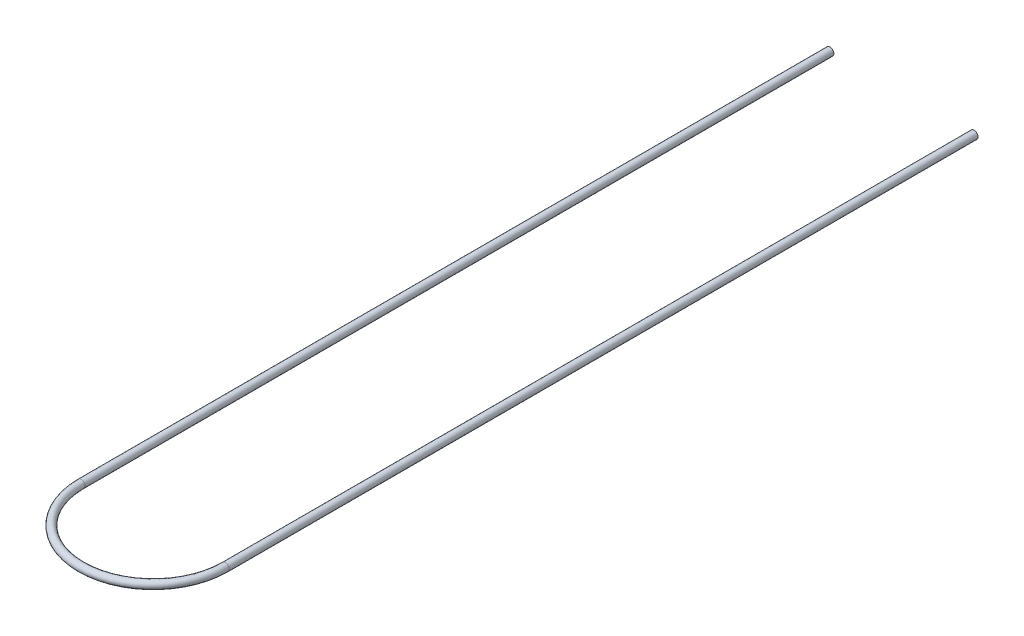
ISO-10303-21;
HEADER;
FILE_DESCRIPTION(('STEP AP214'),'2;1');
FILE_NAME('part.step','',(''),(''),'','','');
FILE_SCHEMA(('AUTOMOTIVE_DESIGN { 1 0 10303 214 1 1 1 1 }'));
ENDSEC;
DATA;
#1=APPLICATION_CONTEXT('core data for automotive mechanical design processes');
#2=APPLICATION_PROTOCOL_DEFINITION('international standard','automotive_design',2000,#1);
#3=PRODUCT_CONTEXT('',#1,'mechanical');
#4=PRODUCT('Part','Part','',(#3));
#5=PRODUCT_RELATED_PRODUCT_CATEGORY('part','',(#4));
#6=PRODUCT_DEFINITION_FORMATION('','',#4);
#7=PRODUCT_DEFINITION_CONTEXT('part definition',#1,'design');
#8=PRODUCT_DEFINITION('design','',#6,#7);
#9=PRODUCT_DEFINITION_SHAPE('','',#8);
#10=(LENGTH_UNIT() NAMED_UNIT(*) SI_UNIT(.MILLI.,.METRE.));
#11=(NAMED_UNIT(*) PLANE_ANGLE_UNIT() SI_UNIT($,.RADIAN.));
#12=(NAMED_UNIT(*) SI_UNIT($,.STERADIAN.) SOLID_ANGLE_UNIT());
#13=UNCERTAINTY_MEASURE_WITH_UNIT(LENGTH_MEASURE(1.E-05),#10,'distance_accuracy_value','');
#14=(GEOMETRIC_REPRESENTATION_CONTEXT(3) GLOBAL_UNCERTAINTY_ASSIGNED_CONTEXT((#13)) GLOBAL_UNIT_ASSIGNED_CONTEXT((#10,
#11,#12)) REPRESENTATION_CONTEXT('',''));
#15=CARTESIAN_POINT('',(0.,0.,0.));
#16=DIRECTION('',(0.,0.,1.));
#17=DIRECTION('',(1.,0.,0.));
#18=AXIS2_PLACEMENT_3D('',#15,#16,#17);
#19=CARTESIAN_POINT('',(-40.,0.,299.999999999999));
#20=DIRECTION('',(0.,0.,1.));
#21=DIRECTION('',(1.,0.,0.));
#22=AXIS2_PLACEMENT_3D('',#19,#20,#21);
#23=CYLINDRICAL_SURFACE('',#22,11.1);
#24=CARTESIAN_POINT('',(-39.9999999999997,0.,2440.));
#25=DIRECTION('',(0.,0.,1.));
#26=DIRECTION('',(1.,0.,0.));
#27=AXIS2_PLACEMENT_3D('',#24,#25,#26);
#28=CIRCLE('',#27,11.1);
#29=CARTESIAN_POINT('',(-51.0999999999997,0.,2440.));
#30=VERTEX_POINT('',#29);
#31=EDGE_CURVE('E54',#30,#30,#28,.T.);
#32=ORIENTED_EDGE('',*,*,#31,.F.);
#33=EDGE_LOOP('',(#32));
#34=FACE_BOUND('',#33,.T.);
#35=CARTESIAN_POINT('',(-40.,0.,299.999999999999));
#36=DIRECTION('',(0.,0.,1.));
#37=DIRECTION('',(1.,0.,0.));
#38=AXIS2_PLACEMENT_3D('',#35,#36,#37);
#39=CIRCLE('',#38,11.1);
#40=CARTESIAN_POINT('',(-28.9,0.,299.999999999999));
#41=VERTEX_POINT('',#40);
#42=EDGE_CURVE('E52',#41,#41,#39,.T.);
#43=ORIENTED_EDGE('',*,*,#42,.T.);
#44=EDGE_LOOP('',(#43));
#45=FACE_BOUND('',#44,.T.);
#46=ADVANCED_FACE('F31',(#34,#45),#23,.T.);
#47=CARTESIAN_POINT('',(166.,0.,2440.));
#48=DIRECTION('',(0.,1.,0.));
#49=DIRECTION('',(0.,0.,1.));
#50=AXIS2_PLACEMENT_3D('',#47,#48,#49);
#51=TOROIDAL_SURFACE('',#50,206.,11.1);
#52=CARTESIAN_POINT('',(372.,0.,2440.));
#53=DIRECTION('',(0.,0.,-1.));
#54=DIRECTION('',(-1.,0.,0.));
#55=AXIS2_PLACEMENT_3D('',#52,#53,#54);
#56=CIRCLE('',#55,11.1);
#57=CARTESIAN_POINT('',(383.1,0.,2440.));
#58=VERTEX_POINT('',#57);
#59=EDGE_CURVE('E35',#58,#58,#56,.T.);
#60=CARTESIAN_POINT('',(166.,0.,2440.));
#61=DIRECTION('',(0.,1.,0.));
#62=DIRECTION('',(0.,0.,1.));
#63=AXIS2_PLACEMENT_3D('',#60,#61,#62);
#64=CIRCLE('',#63,217.1);
#65=EDGE_CURVE('',#30,#58,#64,.T.);
#66=ORIENTED_EDGE('',*,*,#31,.T.);
#67=ORIENTED_EDGE('',*,*,#59,.F.);
#68=ORIENTED_EDGE('',*,*,#65,.T.);
#69=ORIENTED_EDGE('',*,*,#65,.F.);
#70=EDGE_LOOP('',(#66,#68,#67,#69));
#71=FACE_BOUND('',#70,.T.);
#72=ADVANCED_FACE('F62',(#71),#51,.T.);
#73=CARTESIAN_POINT('',(372.,0.,2440.));
#74=DIRECTION('',(0.,0.,-1.));
#75=DIRECTION('',(-1.,0.,0.));
#76=AXIS2_PLACEMENT_3D('',#73,#74,#75);
#77=CYLINDRICAL_SURFACE('',#76,11.1);
#78=CARTESIAN_POINT('',(372.,0.,299.999999999999));
#79=DIRECTION('',(0.,0.,-1.));
#80=DIRECTION('',(-1.,0.,0.));
#81=AXIS2_PLACEMENT_3D('',#78,#79,#80);
#82=CIRCLE('',#81,11.1);
#83=CARTESIAN_POINT('',(360.9,0.,299.999999999999));
#84=VERTEX_POINT('',#83);
#85=EDGE_CURVE('E48',#84,#84,#82,.T.);
#86=ORIENTED_EDGE('',*,*,#85,.F.);
#87=EDGE_LOOP('',(#86));
#88=FACE_BOUND('',#87,.T.);
#89=ORIENTED_EDGE('',*,*,#59,.T.);
#90=EDGE_LOOP('',(#89));
#91=FACE_BOUND('',#90,.T.);
#92=ADVANCED_FACE('F33',(#88,#91),#77,.T.);
#93=CARTESIAN_POINT('',(-40.,0.,299.999999999999));
#94=DIRECTION('',(0.,0.,1.));
#95=DIRECTION('',(1.,0.,0.));
#96=AXIS2_PLACEMENT_3D('',#93,#94,#95);
#97=PLANE('',#96);
#98=CARTESIAN_POINT('',(-40.,0.,299.999999999999));
#99=DIRECTION('',(0.,0.,1.));
#100=DIRECTION('',(1.,0.,0.));
#101=AXIS2_PLACEMENT_3D('',#98,#99,#100);
#102=CIRCLE('',#101,9.95000000000001);
#103=CARTESIAN_POINT('',(-30.05,0.,299.999999999999));
#104=VERTEX_POINT('',#103);
#105=EDGE_CURVE('E51',#104,#104,#102,.F.);
#106=ORIENTED_EDGE('',*,*,#105,.F.);
#107=EDGE_LOOP('',(#106));
#108=FACE_BOUND('',#107,.T.);
#109=ORIENTED_EDGE('',*,*,#42,.F.);
#110=EDGE_LOOP('',(#109));
#111=FACE_BOUND('',#110,.T.);
#112=ADVANCED_FACE('F68',(#108,#111),#97,.F.);
#113=CARTESIAN_POINT('',(372.,0.,299.999999999999));
#114=DIRECTION('',(0.,0.,-1.));
#115=DIRECTION('',(-1.,0.,0.));
#116=AXIS2_PLACEMENT_3D('',#113,#114,#115);
#117=PLANE('',#116);
#118=CARTESIAN_POINT('',(372.,0.,299.999999999999));
#119=DIRECTION('',(0.,0.,-1.));
#120=DIRECTION('',(-1.,0.,0.));
#121=AXIS2_PLACEMENT_3D('',#118,#119,#120);
#122=CIRCLE('',#121,9.95000000000001);
#123=CARTESIAN_POINT('',(362.05,0.,299.999999999999));
#124=VERTEX_POINT('',#123);
#125=EDGE_CURVE('E10',#124,#124,#122,.F.);
#126=ORIENTED_EDGE('',*,*,#125,.T.);
#127=EDGE_LOOP('',(#126));
#128=FACE_BOUND('',#127,.T.);
#129=ORIENTED_EDGE('',*,*,#85,.T.);
#130=EDGE_LOOP('',(#129));
#131=FACE_BOUND('',#130,.T.);
#132=ADVANCED_FACE('F86',(#128,#131),#117,.T.);
#133=CARTESIAN_POINT('',(-40.,0.,299.999999999999));
#134=DIRECTION('',(0.,0.,1.));
#135=DIRECTION('',(1.,0.,0.));
#136=AXIS2_PLACEMENT_3D('',#133,#134,#135);
#137=CYLINDRICAL_SURFACE('',#136,9.95000000000001);
#138=CARTESIAN_POINT('',(-39.9999999999997,0.,2440.));
#139=DIRECTION('',(0.,0.,1.));
#140=DIRECTION('',(1.,0.,0.));
#141=AXIS2_PLACEMENT_3D('',#138,#139,#140);
#142=CIRCLE('',#141,9.95000000000001);
#143=CARTESIAN_POINT('',(-49.9499999999997,0.,2440.));
#144=VERTEX_POINT('',#143);
#145=EDGE_CURVE('E44',#144,#144,#142,.F.);
#146=ORIENTED_EDGE('',*,*,#145,.F.);
#147=EDGE_LOOP('',(#146));
#148=FACE_BOUND('',#147,.T.);
#149=ORIENTED_EDGE('',*,*,#105,.T.);
#150=EDGE_LOOP('',(#149));
#151=FACE_BOUND('',#150,.T.);
#152=ADVANCED_FACE('F80',(#148,#151),#137,.F.);
#153=CARTESIAN_POINT('',(166.,0.,2440.));
#154=DIRECTION('',(0.,1.,0.));
#155=DIRECTION('',(0.,0.,1.));
#156=AXIS2_PLACEMENT_3D('',#153,#154,#155);
#157=TOROIDAL_SURFACE('',#156,206.,9.95000000000001);
#158=CARTESIAN_POINT('',(372.,0.,2440.));
#159=DIRECTION('',(0.,0.,-1.));
#160=DIRECTION('',(-1.,0.,0.));
#161=AXIS2_PLACEMENT_3D('',#158,#159,#160);
#162=CIRCLE('',#161,9.95000000000001);
#163=CARTESIAN_POINT('',(381.95,0.,2440.));
#164=VERTEX_POINT('',#163);
#165=EDGE_CURVE('E39',#164,#164,#162,.F.);
#166=CARTESIAN_POINT('',(166.,0.,2440.));
#167=DIRECTION('',(0.,1.,0.));
#168=DIRECTION('',(0.,0.,1.));
#169=AXIS2_PLACEMENT_3D('',#166,#167,#168);
#170=CIRCLE('',#169,215.95);
#171=EDGE_CURVE('',#144,#164,#170,.T.);
#172=ORIENTED_EDGE('',*,*,#145,.T.);
#173=ORIENTED_EDGE('',*,*,#165,.F.);
#174=ORIENTED_EDGE('',*,*,#171,.T.);
#175=ORIENTED_EDGE('',*,*,#171,.F.);
#176=EDGE_LOOP('',(#172,#174,#173,#175));
#177=FACE_BOUND('',#176,.T.);
#178=ADVANCED_FACE('F74',(#177),#157,.F.);
#179=CARTESIAN_POINT('',(372.,0.,2440.));
#180=DIRECTION('',(0.,0.,-1.));
#181=DIRECTION('',(-1.,0.,0.));
#182=AXIS2_PLACEMENT_3D('',#179,#180,#181);
#183=CYLINDRICAL_SURFACE('',#182,9.95000000000001);
#184=ORIENTED_EDGE('',*,*,#125,.F.);
#185=EDGE_LOOP('',(#184));
#186=FACE_BOUND('',#185,.T.);
#187=ORIENTED_EDGE('',*,*,#165,.T.);
#188=EDGE_LOOP('',(#187));
#189=FACE_BOUND('',#188,.T.);
#190=ADVANCED_FACE('F72',(#186,#189),#183,.F.);
#191=CLOSED_SHELL('',(#46,#72,#92,#112,#132,#152,#178,#190));
#192=MANIFOLD_SOLID_BREP('B2',#191);
#193=ADVANCED_BREP_SHAPE_REPRESENTATION('',(#18,#192),#14);
#194=SHAPE_DEFINITION_REPRESENTATION(#9,#193);
ENDSEC;
END-ISO-10303-21;
